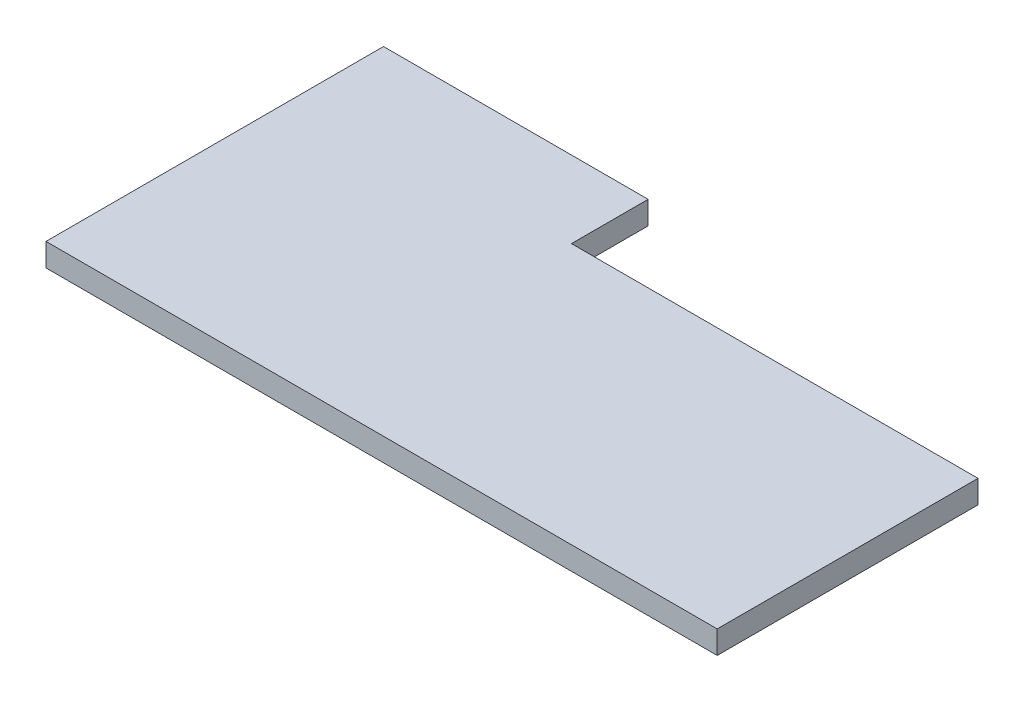
ISO-10303-21;
HEADER;
FILE_DESCRIPTION(('STEP AP214'),'2;1');
FILE_NAME('part.step','',(''),(''),'','','');
FILE_SCHEMA(('AUTOMOTIVE_DESIGN { 1 0 10303 214 1 1 1 1 }'));
ENDSEC;
DATA;
#1=APPLICATION_CONTEXT('core data for automotive mechanical design processes');
#2=APPLICATION_PROTOCOL_DEFINITION('international standard','automotive_design',2000,#1);
#3=PRODUCT_CONTEXT('',#1,'mechanical');
#4=PRODUCT('Part','Part','',(#3));
#5=PRODUCT_RELATED_PRODUCT_CATEGORY('part','',(#4));
#6=PRODUCT_DEFINITION_FORMATION('','',#4);
#7=PRODUCT_DEFINITION_CONTEXT('part definition',#1,'design');
#8=PRODUCT_DEFINITION('design','',#6,#7);
#9=PRODUCT_DEFINITION_SHAPE('','',#8);
#10=(LENGTH_UNIT() NAMED_UNIT(*) SI_UNIT(.MILLI.,.METRE.));
#11=(NAMED_UNIT(*) PLANE_ANGLE_UNIT() SI_UNIT($,.RADIAN.));
#12=(NAMED_UNIT(*) SI_UNIT($,.STERADIAN.) SOLID_ANGLE_UNIT());
#13=UNCERTAINTY_MEASURE_WITH_UNIT(LENGTH_MEASURE(1.E-05),#10,'distance_accuracy_value','');
#14=(GEOMETRIC_REPRESENTATION_CONTEXT(3) GLOBAL_UNCERTAINTY_ASSIGNED_CONTEXT((#13)) GLOBAL_UNIT_ASSIGNED_CONTEXT((#10,
#11,#12)) REPRESENTATION_CONTEXT('',''));
#15=CARTESIAN_POINT('',(0.,0.,0.));
#16=DIRECTION('',(0.,0.,1.));
#17=DIRECTION('',(1.,0.,0.));
#18=AXIS2_PLACEMENT_3D('',#15,#16,#17);
#19=CARTESIAN_POINT('',(0.,6.00000000000001,0.));
#20=DIRECTION('',(1.,0.,0.));
#21=DIRECTION('',(0.,0.,-0.999999999999999));
#22=AXIS2_PLACEMENT_3D('',#19,#20,#21);
#23=PLANE('',#22);
#24=DIRECTION('',(0.,0.,0.999999999999999));
#25=VECTOR('',#24,1.);
#26=CARTESIAN_POINT('',(0.,0.,0.));
#27=LINE('',#26,#25);
#28=CARTESIAN_POINT('',(0.,0.,-88.));
#29=VERTEX_POINT('',#28);
#30=CARTESIAN_POINT('',(0.,0.,0.));
#31=VERTEX_POINT('',#30);
#32=EDGE_CURVE('E113',#29,#31,#27,.T.);
#33=ORIENTED_EDGE('',*,*,#32,.T.);
#34=DIRECTION('',(0.,-1.,0.));
#35=VECTOR('',#34,1.);
#36=CARTESIAN_POINT('',(0.,6.00000000000001,0.));
#37=LINE('',#36,#35);
#38=CARTESIAN_POINT('',(0.,6.00000000000001,0.));
#39=VERTEX_POINT('',#38);
#40=EDGE_CURVE('E11',#39,#31,#37,.T.);
#41=ORIENTED_EDGE('',*,*,#40,.F.);
#42=DIRECTION('',(0.,0.,0.999999999999999));
#43=VECTOR('',#42,1.);
#44=CARTESIAN_POINT('',(0.,6.00000000000001,0.));
#45=LINE('',#44,#43);
#46=CARTESIAN_POINT('',(0.,5.99999999999998,-88.));
#47=VERTEX_POINT('',#46);
#48=EDGE_CURVE('E123',#47,#39,#45,.T.);
#49=ORIENTED_EDGE('',*,*,#48,.F.);
#50=DIRECTION('',(0.,-1.,0.));
#51=VECTOR('',#50,1.);
#52=CARTESIAN_POINT('',(0.,5.99999999999998,-88.));
#53=LINE('',#52,#51);
#54=EDGE_CURVE('E109',#47,#29,#53,.T.);
#55=ORIENTED_EDGE('',*,*,#54,.T.);
#56=EDGE_LOOP('',(#33,#41,#49,#55));
#57=FACE_BOUND('',#56,.T.);
#58=ADVANCED_FACE('F29',(#57),#23,.F.);
#59=CARTESIAN_POINT('',(0.,6.00000000000001,0.));
#60=DIRECTION('',(0.,0.,-0.999999999999999));
#61=DIRECTION('',(-1.,0.,0.));
#62=AXIS2_PLACEMENT_3D('',#59,#60,#61);
#63=PLANE('',#62);
#64=DIRECTION('',(1.,0.,0.));
#65=VECTOR('',#64,1.);
#66=CARTESIAN_POINT('',(0.,0.,0.));
#67=LINE('',#66,#65);
#68=CARTESIAN_POINT('',(175.,0.,0.));
#69=VERTEX_POINT('',#68);
#70=EDGE_CURVE('E116',#31,#69,#67,.T.);
#71=ORIENTED_EDGE('',*,*,#70,.T.);
#72=DIRECTION('',(0.,-1.,0.));
#73=VECTOR('',#72,1.);
#74=CARTESIAN_POINT('',(175.,6.00000000000001,1.11022302462516E-13));
#75=LINE('',#74,#73);
#76=CARTESIAN_POINT('',(175.,6.00000000000001,1.11022302462516E-13));
#77=VERTEX_POINT('',#76);
#78=EDGE_CURVE('E37',#77,#69,#75,.T.);
#79=ORIENTED_EDGE('',*,*,#78,.F.);
#80=DIRECTION('',(1.,0.,0.));
#81=VECTOR('',#80,1.);
#82=CARTESIAN_POINT('',(0.,6.00000000000001,0.));
#83=LINE('',#82,#81);
#84=EDGE_CURVE('E82',#39,#77,#83,.T.);
#85=ORIENTED_EDGE('',*,*,#84,.F.);
#86=ORIENTED_EDGE('',*,*,#40,.T.);
#87=EDGE_LOOP('',(#71,#79,#85,#86));
#88=FACE_BOUND('',#87,.T.);
#89=ADVANCED_FACE('F147',(#88),#63,.F.);
#90=CARTESIAN_POINT('',(175.,6.00000000000001,1.11022302462516E-13));
#91=DIRECTION('',(-1.,0.,0.));
#92=DIRECTION('',(0.,0.,0.999999999999999));
#93=AXIS2_PLACEMENT_3D('',#90,#91,#92);
#94=PLANE('',#93);
#95=DIRECTION('',(0.,0.,-0.999999999999999));
#96=VECTOR('',#95,1.);
#97=CARTESIAN_POINT('',(175.,0.,0.));
#98=LINE('',#97,#96);
#99=CARTESIAN_POINT('',(175.,0.,-67.9999999999998));
#100=VERTEX_POINT('',#99);
#101=EDGE_CURVE('E118',#69,#100,#98,.T.);
#102=ORIENTED_EDGE('',*,*,#101,.T.);
#103=DIRECTION('',(0.,-1.,0.));
#104=VECTOR('',#103,1.);
#105=CARTESIAN_POINT('',(175.,6.00000000000001,-67.9999999999998));
#106=LINE('',#105,#104);
#107=CARTESIAN_POINT('',(175.,6.00000000000001,-67.9999999999998));
#108=VERTEX_POINT('',#107);
#109=EDGE_CURVE('E104',#108,#100,#106,.T.);
#110=ORIENTED_EDGE('',*,*,#109,.F.);
#111=DIRECTION('',(0.,0.,-0.999999999999999));
#112=VECTOR('',#111,1.);
#113=CARTESIAN_POINT('',(175.,6.00000000000001,1.11022302462516E-13));
#114=LINE('',#113,#112);
#115=EDGE_CURVE('E95',#77,#108,#114,.T.);
#116=ORIENTED_EDGE('',*,*,#115,.F.);
#117=ORIENTED_EDGE('',*,*,#78,.T.);
#118=EDGE_LOOP('',(#102,#110,#116,#117));
#119=FACE_BOUND('',#118,.T.);
#120=ADVANCED_FACE('F129',(#119),#94,.F.);
#121=CARTESIAN_POINT('',(69.,6.00000000000001,-67.9999999999998));
#122=DIRECTION('',(0.,0.,0.999999999999999));
#123=DIRECTION('',(1.,0.,0.));
#124=AXIS2_PLACEMENT_3D('',#121,#122,#123);
#125=PLANE('',#124);
#126=DIRECTION('',(-1.,0.,0.));
#127=VECTOR('',#126,1.);
#128=CARTESIAN_POINT('',(69.,0.,-67.9999999999998));
#129=LINE('',#128,#127);
#130=CARTESIAN_POINT('',(69.,0.,-67.9999999999998));
#131=VERTEX_POINT('',#130);
#132=EDGE_CURVE('E103',#100,#131,#129,.T.);
#133=ORIENTED_EDGE('',*,*,#132,.T.);
#134=DIRECTION('',(0.,-1.,0.));
#135=VECTOR('',#134,1.);
#136=CARTESIAN_POINT('',(69.,6.00000000000001,-67.9999999999998));
#137=LINE('',#136,#135);
#138=CARTESIAN_POINT('',(69.,6.00000000000001,-67.9999999999998));
#139=VERTEX_POINT('',#138);
#140=EDGE_CURVE('E100',#139,#131,#137,.T.);
#141=ORIENTED_EDGE('',*,*,#140,.F.);
#142=DIRECTION('',(-1.,0.,0.));
#143=VECTOR('',#142,1.);
#144=CARTESIAN_POINT('',(69.,6.00000000000001,-67.9999999999998));
#145=LINE('',#144,#143);
#146=EDGE_CURVE('E89',#108,#139,#145,.T.);
#147=ORIENTED_EDGE('',*,*,#146,.F.);
#148=ORIENTED_EDGE('',*,*,#109,.T.);
#149=EDGE_LOOP('',(#133,#141,#147,#148));
#150=FACE_BOUND('',#149,.T.);
#151=ADVANCED_FACE('F101',(#150),#125,.F.);
#152=CARTESIAN_POINT('',(69.,6.00000000000001,-67.9999999999998));
#153=DIRECTION('',(-1.,0.,0.));
#154=DIRECTION('',(0.,0.,0.999999999999999));
#155=AXIS2_PLACEMENT_3D('',#152,#153,#154);
#156=PLANE('',#155);
#157=DIRECTION('',(0.,0.,-0.999999999999999));
#158=VECTOR('',#157,1.);
#159=CARTESIAN_POINT('',(69.,0.,-67.9999999999998));
#160=LINE('',#159,#158);
#161=CARTESIAN_POINT('',(69.,0.,-87.9999999999999));
#162=VERTEX_POINT('',#161);
#163=EDGE_CURVE('E68',#131,#162,#160,.T.);
#164=ORIENTED_EDGE('',*,*,#163,.T.);
#165=DIRECTION('',(0.,-1.,0.));
#166=VECTOR('',#165,1.);
#167=CARTESIAN_POINT('',(69.,6.00000000000001,-87.9999999999999));
#168=LINE('',#167,#166);
#169=CARTESIAN_POINT('',(69.,6.00000000000001,-87.9999999999999));
#170=VERTEX_POINT('',#169);
#171=EDGE_CURVE('E105',#170,#162,#168,.T.);
#172=ORIENTED_EDGE('',*,*,#171,.F.);
#173=DIRECTION('',(0.,0.,-0.999999999999999));
#174=VECTOR('',#173,1.);
#175=CARTESIAN_POINT('',(69.,6.00000000000001,-67.9999999999998));
#176=LINE('',#175,#174);
#177=EDGE_CURVE('E93',#139,#170,#176,.T.);
#178=ORIENTED_EDGE('',*,*,#177,.F.);
#179=ORIENTED_EDGE('',*,*,#140,.T.);
#180=EDGE_LOOP('',(#164,#172,#178,#179));
#181=FACE_BOUND('',#180,.T.);
#182=ADVANCED_FACE('F107',(#181),#156,.F.);
#183=CARTESIAN_POINT('',(0.,5.99999999999998,-88.));
#184=DIRECTION('',(0.,0.,0.999999999999999));
#185=DIRECTION('',(1.,0.,0.));
#186=AXIS2_PLACEMENT_3D('',#183,#184,#185);
#187=PLANE('',#186);
#188=DIRECTION('',(-1.,0.,0.));
#189=VECTOR('',#188,1.);
#190=CARTESIAN_POINT('',(0.,0.,-88.));
#191=LINE('',#190,#189);
#192=EDGE_CURVE('E74',#162,#29,#191,.T.);
#193=ORIENTED_EDGE('',*,*,#192,.T.);
#194=ORIENTED_EDGE('',*,*,#54,.F.);
#195=DIRECTION('',(-1.,0.,0.));
#196=VECTOR('',#195,1.);
#197=CARTESIAN_POINT('',(0.,5.99999999999998,-88.));
#198=LINE('',#197,#196);
#199=EDGE_CURVE('E45',#170,#47,#198,.T.);
#200=ORIENTED_EDGE('',*,*,#199,.F.);
#201=ORIENTED_EDGE('',*,*,#171,.T.);
#202=EDGE_LOOP('',(#193,#194,#200,#201));
#203=FACE_BOUND('',#202,.T.);
#204=ADVANCED_FACE('F136',(#203),#187,.F.);
#205=CARTESIAN_POINT('',(0.,6.00000000000001,0.));
#206=DIRECTION('',(0.,-1.,0.));
#207=DIRECTION('',(0.,0.,-0.999999999999999));
#208=AXIS2_PLACEMENT_3D('',#205,#206,#207);
#209=PLANE('',#208);
#210=ORIENTED_EDGE('',*,*,#48,.T.);
#211=ORIENTED_EDGE('',*,*,#84,.T.);
#212=ORIENTED_EDGE('',*,*,#115,.T.);
#213=ORIENTED_EDGE('',*,*,#146,.T.);
#214=ORIENTED_EDGE('',*,*,#177,.T.);
#215=ORIENTED_EDGE('',*,*,#199,.T.);
#216=EDGE_LOOP('',(#210,#211,#212,#213,#214,#215));
#217=FACE_BOUND('',#216,.T.);
#218=ADVANCED_FACE('F91',(#217),#209,.F.);
#219=CARTESIAN_POINT('',(0.,0.,0.));
#220=DIRECTION('',(0.,-1.,0.));
#221=DIRECTION('',(0.,0.,-0.999999999999999));
#222=AXIS2_PLACEMENT_3D('',#219,#220,#221);
#223=PLANE('',#222);
#224=ORIENTED_EDGE('',*,*,#32,.F.);
#225=ORIENTED_EDGE('',*,*,#192,.F.);
#226=ORIENTED_EDGE('',*,*,#163,.F.);
#227=ORIENTED_EDGE('',*,*,#132,.F.);
#228=ORIENTED_EDGE('',*,*,#101,.F.);
#229=ORIENTED_EDGE('',*,*,#70,.F.);
#230=EDGE_LOOP('',(#224,#225,#226,#227,#228,#229));
#231=FACE_BOUND('',#230,.T.);
#232=ADVANCED_FACE('F132',(#231),#223,.T.);
#233=CLOSED_SHELL('',(#58,#89,#120,#151,#182,#204,#218,#232));
#234=MANIFOLD_SOLID_BREP('B2',#233);
#235=ADVANCED_BREP_SHAPE_REPRESENTATION('',(#18,#234),#14);
#236=SHAPE_DEFINITION_REPRESENTATION(#9,#235);
ENDSEC;
END-ISO-10303-21;
